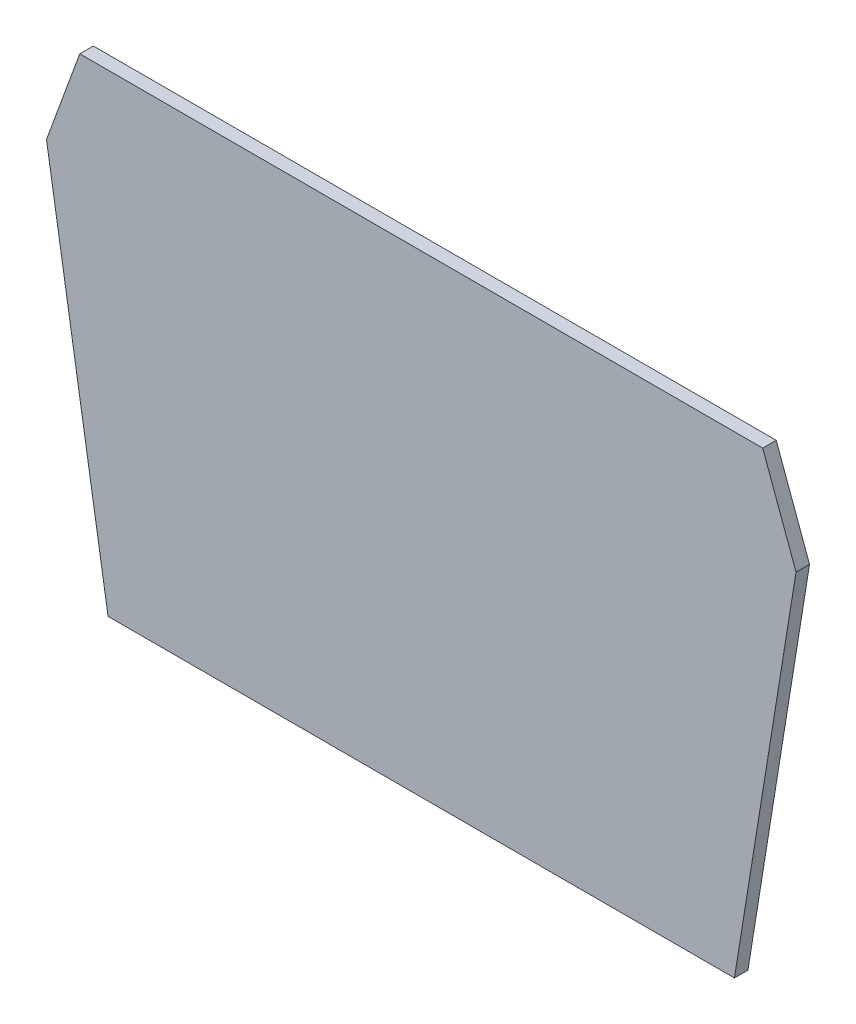
ISO-10303-21;
HEADER;
FILE_DESCRIPTION(('STEP AP214'),'2;1');
FILE_NAME('part.step','',(''),(''),'','','');
FILE_SCHEMA(('AUTOMOTIVE_DESIGN { 1 0 10303 214 1 1 1 1 }'));
ENDSEC;
DATA;
#1=APPLICATION_CONTEXT('core data for automotive mechanical design processes');
#2=APPLICATION_PROTOCOL_DEFINITION('international standard','automotive_design',2000,#1);
#3=PRODUCT_CONTEXT('',#1,'mechanical');
#4=PRODUCT('Part','Part','',(#3));
#5=PRODUCT_RELATED_PRODUCT_CATEGORY('part','',(#4));
#6=PRODUCT_DEFINITION_FORMATION('','',#4);
#7=PRODUCT_DEFINITION_CONTEXT('part definition',#1,'design');
#8=PRODUCT_DEFINITION('design','',#6,#7);
#9=PRODUCT_DEFINITION_SHAPE('','',#8);
#10=(LENGTH_UNIT() NAMED_UNIT(*) SI_UNIT(.MILLI.,.METRE.));
#11=(NAMED_UNIT(*) PLANE_ANGLE_UNIT() SI_UNIT($,.RADIAN.));
#12=(NAMED_UNIT(*) SI_UNIT($,.STERADIAN.) SOLID_ANGLE_UNIT());
#13=UNCERTAINTY_MEASURE_WITH_UNIT(LENGTH_MEASURE(1.E-05),#10,'distance_accuracy_value','');
#14=(GEOMETRIC_REPRESENTATION_CONTEXT(3) GLOBAL_UNCERTAINTY_ASSIGNED_CONTEXT((#13)) GLOBAL_UNIT_ASSIGNED_CONTEXT((#10,
#11,#12)) REPRESENTATION_CONTEXT('',''));
#15=CARTESIAN_POINT('',(0.,0.,0.));
#16=DIRECTION('',(0.,0.,1.));
#17=DIRECTION('',(1.,0.,0.));
#18=AXIS2_PLACEMENT_3D('',#15,#16,#17);
#19=CARTESIAN_POINT('',(352.146351868688,328.38676755739,12.7));
#20=DIRECTION('',(-0.938778980047703,-0.344519994514969,0.));
#21=DIRECTION('',(0.344519994514969,-0.938778980047703,0.));
#22=AXIS2_PLACEMENT_3D('',#19,#20,#21);
#23=PLANE('',#22);
#24=DIRECTION('',(-0.344519994514969,0.938778980047703,0.));
#25=VECTOR('',#24,1.);
#26=CARTESIAN_POINT('',(352.146351868688,328.38676755739,0.));
#27=LINE('',#26,#25);
#28=CARTESIAN_POINT('',(352.146351868688,328.38676755739,0.));
#29=VERTEX_POINT('',#28);
#30=CARTESIAN_POINT('',(320.836522370954,413.702599060092,0.));
#31=VERTEX_POINT('',#30);
#32=EDGE_CURVE('E122',#29,#31,#27,.T.);
#33=ORIENTED_EDGE('',*,*,#32,.T.);
#34=DIRECTION('',(0.,0.,-1.));
#35=VECTOR('',#34,1.);
#36=CARTESIAN_POINT('',(320.836522370954,413.702599060092,12.7));
#37=LINE('',#36,#35);
#38=CARTESIAN_POINT('',(320.836522370954,413.702599060092,12.7));
#39=VERTEX_POINT('',#38);
#40=EDGE_CURVE('E11',#39,#31,#37,.T.);
#41=ORIENTED_EDGE('',*,*,#40,.F.);
#42=DIRECTION('',(-0.344519994514969,0.938778980047703,0.));
#43=VECTOR('',#42,1.);
#44=CARTESIAN_POINT('',(352.146351868688,328.38676755739,12.7));
#45=LINE('',#44,#43);
#46=CARTESIAN_POINT('',(352.146351868688,328.38676755739,12.7));
#47=VERTEX_POINT('',#46);
#48=EDGE_CURVE('E132',#47,#39,#45,.T.);
#49=ORIENTED_EDGE('',*,*,#48,.F.);
#50=DIRECTION('',(0.,0.,-1.));
#51=VECTOR('',#50,1.);
#52=CARTESIAN_POINT('',(352.146351868688,328.38676755739,12.7));
#53=LINE('',#52,#51);
#54=EDGE_CURVE('E118',#47,#29,#53,.T.);
#55=ORIENTED_EDGE('',*,*,#54,.T.);
#56=EDGE_LOOP('',(#33,#41,#49,#55));
#57=FACE_BOUND('',#56,.T.);
#58=ADVANCED_FACE('F38',(#57),#23,.F.);
#59=CARTESIAN_POINT('',(-320.836522370954,413.702599060092,12.7));
#60=DIRECTION('',(0.,-1.,0.));
#61=DIRECTION('',(1.,0.,0.));
#62=AXIS2_PLACEMENT_3D('',#59,#60,#61);
#63=PLANE('',#62);
#64=DIRECTION('',(-1.,0.,0.));
#65=VECTOR('',#64,1.);
#66=CARTESIAN_POINT('',(-320.836522370954,413.702599060092,0.));
#67=LINE('',#66,#65);
#68=CARTESIAN_POINT('',(-320.836522370954,413.702599060092,0.));
#69=VERTEX_POINT('',#68);
#70=EDGE_CURVE('E125',#31,#69,#67,.T.);
#71=ORIENTED_EDGE('',*,*,#70,.T.);
#72=DIRECTION('',(0.,0.,-1.));
#73=VECTOR('',#72,1.);
#74=CARTESIAN_POINT('',(-320.836522370954,413.702599060092,12.7));
#75=LINE('',#74,#73);
#76=CARTESIAN_POINT('',(-320.836522370954,413.702599060092,12.7));
#77=VERTEX_POINT('',#76);
#78=EDGE_CURVE('E46',#77,#69,#75,.T.);
#79=ORIENTED_EDGE('',*,*,#78,.F.);
#80=DIRECTION('',(-1.,0.,0.));
#81=VECTOR('',#80,1.);
#82=CARTESIAN_POINT('',(-320.836522370954,413.702599060092,12.7));
#83=LINE('',#82,#81);
#84=EDGE_CURVE('E91',#39,#77,#83,.T.);
#85=ORIENTED_EDGE('',*,*,#84,.F.);
#86=ORIENTED_EDGE('',*,*,#40,.T.);
#87=EDGE_LOOP('',(#71,#79,#85,#86));
#88=FACE_BOUND('',#87,.T.);
#89=ADVANCED_FACE('F156',(#88),#63,.F.);
#90=CARTESIAN_POINT('',(-352.146351868688,328.38676755739,12.7));
#91=DIRECTION('',(0.938778980047703,-0.344519994514969,0.));
#92=DIRECTION('',(0.344519994514969,0.938778980047703,0.));
#93=AXIS2_PLACEMENT_3D('',#90,#91,#92);
#94=PLANE('',#93);
#95=DIRECTION('',(-0.344519994514969,-0.938778980047703,0.));
#96=VECTOR('',#95,1.);
#97=CARTESIAN_POINT('',(-352.146351868688,328.38676755739,0.));
#98=LINE('',#97,#96);
#99=CARTESIAN_POINT('',(-352.146351868688,328.38676755739,0.));
#100=VERTEX_POINT('',#99);
#101=EDGE_CURVE('E127',#69,#100,#98,.T.);
#102=ORIENTED_EDGE('',*,*,#101,.T.);
#103=DIRECTION('',(0.,0.,-1.));
#104=VECTOR('',#103,1.);
#105=CARTESIAN_POINT('',(-352.146351868688,328.38676755739,12.7));
#106=LINE('',#105,#104);
#107=CARTESIAN_POINT('',(-352.146351868688,328.38676755739,12.7));
#108=VERTEX_POINT('',#107);
#109=EDGE_CURVE('E113',#108,#100,#106,.T.);
#110=ORIENTED_EDGE('',*,*,#109,.F.);
#111=DIRECTION('',(-0.344519994514969,-0.938778980047703,0.));
#112=VECTOR('',#111,1.);
#113=CARTESIAN_POINT('',(-352.146351868688,328.38676755739,12.7));
#114=LINE('',#113,#112);
#115=EDGE_CURVE('E104',#77,#108,#114,.T.);
#116=ORIENTED_EDGE('',*,*,#115,.F.);
#117=ORIENTED_EDGE('',*,*,#78,.T.);
#118=EDGE_LOOP('',(#102,#110,#116,#117));
#119=FACE_BOUND('',#118,.T.);
#120=ADVANCED_FACE('F138',(#119),#94,.F.);
#121=CARTESIAN_POINT('',(-294.276699265907,-30.7974009399084,12.7));
#122=DIRECTION('',(0.987268447777699,0.15906291843988,0.));
#123=DIRECTION('',(-0.15906291843988,0.9872684477777,0.));
#124=AXIS2_PLACEMENT_3D('',#121,#122,#123);
#125=PLANE('',#124);
#126=DIRECTION('',(0.15906291843988,-0.987268447777699,0.));
#127=VECTOR('',#126,1.);
#128=CARTESIAN_POINT('',(-294.276699265907,-30.7974009399084,0.));
#129=LINE('',#128,#127);
#130=CARTESIAN_POINT('',(-294.276699265907,-30.7974009399084,0.));
#131=VERTEX_POINT('',#130);
#132=EDGE_CURVE('E112',#100,#131,#129,.T.);
#133=ORIENTED_EDGE('',*,*,#132,.T.);
#134=DIRECTION('',(0.,0.,-1.));
#135=VECTOR('',#134,1.);
#136=CARTESIAN_POINT('',(-294.276699265907,-30.7974009399084,12.7));
#137=LINE('',#136,#135);
#138=CARTESIAN_POINT('',(-294.276699265907,-30.7974009399084,12.7));
#139=VERTEX_POINT('',#138);
#140=EDGE_CURVE('E109',#139,#131,#137,.T.);
#141=ORIENTED_EDGE('',*,*,#140,.F.);
#142=DIRECTION('',(0.15906291843988,-0.987268447777699,0.));
#143=VECTOR('',#142,1.);
#144=CARTESIAN_POINT('',(-294.276699265907,-30.7974009399084,12.7));
#145=LINE('',#144,#143);
#146=EDGE_CURVE('E98',#108,#139,#145,.T.);
#147=ORIENTED_EDGE('',*,*,#146,.F.);
#148=ORIENTED_EDGE('',*,*,#109,.T.);
#149=EDGE_LOOP('',(#133,#141,#147,#148));
#150=FACE_BOUND('',#149,.T.);
#151=ADVANCED_FACE('F110',(#150),#125,.F.);
#152=CARTESIAN_POINT('',(-294.276699265907,-30.7974009399084,12.7));
#153=DIRECTION('',(0.,1.,0.));
#154=DIRECTION('',(-1.,0.,0.));
#155=AXIS2_PLACEMENT_3D('',#152,#153,#154);
#156=PLANE('',#155);
#157=DIRECTION('',(1.,0.,0.));
#158=VECTOR('',#157,1.);
#159=CARTESIAN_POINT('',(-294.276699265907,-30.7974009399084,0.));
#160=LINE('',#159,#158);
#161=CARTESIAN_POINT('',(294.276699265907,-30.7974009399083,0.));
#162=VERTEX_POINT('',#161);
#163=EDGE_CURVE('E77',#131,#162,#160,.T.);
#164=ORIENTED_EDGE('',*,*,#163,.T.);
#165=DIRECTION('',(0.,0.,-1.));
#166=VECTOR('',#165,1.);
#167=CARTESIAN_POINT('',(294.276699265907,-30.7974009399083,12.7));
#168=LINE('',#167,#166);
#169=CARTESIAN_POINT('',(294.276699265907,-30.7974009399083,12.7));
#170=VERTEX_POINT('',#169);
#171=EDGE_CURVE('E114',#170,#162,#168,.T.);
#172=ORIENTED_EDGE('',*,*,#171,.F.);
#173=DIRECTION('',(1.,0.,0.));
#174=VECTOR('',#173,1.);
#175=CARTESIAN_POINT('',(-294.276699265907,-30.7974009399084,12.7));
#176=LINE('',#175,#174);
#177=EDGE_CURVE('E102',#139,#170,#176,.T.);
#178=ORIENTED_EDGE('',*,*,#177,.F.);
#179=ORIENTED_EDGE('',*,*,#140,.T.);
#180=EDGE_LOOP('',(#164,#172,#178,#179));
#181=FACE_BOUND('',#180,.T.);
#182=ADVANCED_FACE('F116',(#181),#156,.F.);
#183=CARTESIAN_POINT('',(294.276699265907,-30.7974009399083,12.7));
#184=DIRECTION('',(-0.987268447777699,0.15906291843988,0.));
#185=DIRECTION('',(-0.15906291843988,-0.9872684477777,0.));
#186=AXIS2_PLACEMENT_3D('',#183,#184,#185);
#187=PLANE('',#186);
#188=DIRECTION('',(0.15906291843988,0.987268447777699,0.));
#189=VECTOR('',#188,1.);
#190=CARTESIAN_POINT('',(294.276699265907,-30.7974009399083,0.));
#191=LINE('',#190,#189);
#192=EDGE_CURVE('E83',#162,#29,#191,.T.);
#193=ORIENTED_EDGE('',*,*,#192,.T.);
#194=ORIENTED_EDGE('',*,*,#54,.F.);
#195=DIRECTION('',(0.15906291843988,0.987268447777699,0.));
#196=VECTOR('',#195,1.);
#197=CARTESIAN_POINT('',(294.276699265907,-30.7974009399083,12.7));
#198=LINE('',#197,#196);
#199=EDGE_CURVE('E54',#170,#47,#198,.T.);
#200=ORIENTED_EDGE('',*,*,#199,.F.);
#201=ORIENTED_EDGE('',*,*,#171,.T.);
#202=EDGE_LOOP('',(#193,#194,#200,#201));
#203=FACE_BOUND('',#202,.T.);
#204=ADVANCED_FACE('F145',(#203),#187,.F.);
#205=CARTESIAN_POINT('',(0.,0.,12.7));
#206=DIRECTION('',(0.,0.,-1.));
#207=DIRECTION('',(-1.,0.,0.));
#208=AXIS2_PLACEMENT_3D('',#205,#206,#207);
#209=PLANE('',#208);
#210=ORIENTED_EDGE('',*,*,#48,.T.);
#211=ORIENTED_EDGE('',*,*,#84,.T.);
#212=ORIENTED_EDGE('',*,*,#115,.T.);
#213=ORIENTED_EDGE('',*,*,#146,.T.);
#214=ORIENTED_EDGE('',*,*,#177,.T.);
#215=ORIENTED_EDGE('',*,*,#199,.T.);
#216=EDGE_LOOP('',(#210,#211,#212,#213,#214,#215));
#217=FACE_BOUND('',#216,.T.);
#218=ADVANCED_FACE('F100',(#217),#209,.F.);
#219=CARTESIAN_POINT('',(0.,0.,0.));
#220=DIRECTION('',(0.,0.,-1.));
#221=DIRECTION('',(-1.,0.,0.));
#222=AXIS2_PLACEMENT_3D('',#219,#220,#221);
#223=PLANE('',#222);
#224=ORIENTED_EDGE('',*,*,#32,.F.);
#225=ORIENTED_EDGE('',*,*,#192,.F.);
#226=ORIENTED_EDGE('',*,*,#163,.F.);
#227=ORIENTED_EDGE('',*,*,#132,.F.);
#228=ORIENTED_EDGE('',*,*,#101,.F.);
#229=ORIENTED_EDGE('',*,*,#70,.F.);
#230=EDGE_LOOP('',(#224,#225,#226,#227,#228,#229));
#231=FACE_BOUND('',#230,.T.);
#232=ADVANCED_FACE('F141',(#231),#223,.T.);
#233=CLOSED_SHELL('',(#58,#89,#120,#151,#182,#204,#218,#232));
#234=MANIFOLD_SOLID_BREP('B2',#233);
#235=ADVANCED_BREP_SHAPE_REPRESENTATION('',(#18,#234),#14);
#236=SHAPE_DEFINITION_REPRESENTATION(#9,#235);
ENDSEC;
END-ISO-10303-21;
